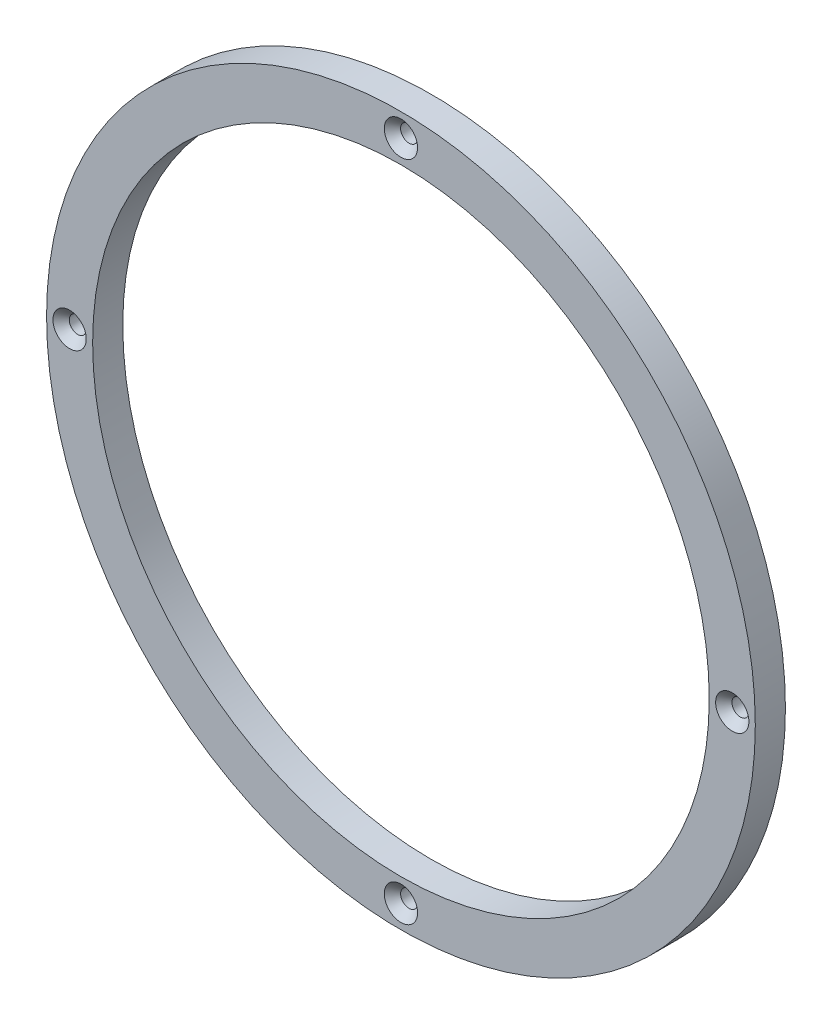
ISO-10303-21;
HEADER;
FILE_DESCRIPTION(('STEP AP214'),'2;1');
FILE_NAME('part.step','',(''),(''),'','','');
FILE_SCHEMA(('AUTOMOTIVE_DESIGN { 1 0 10303 214 1 1 1 1 }'));
ENDSEC;
DATA;
#1=APPLICATION_CONTEXT('core data for automotive mechanical design processes');
#2=APPLICATION_PROTOCOL_DEFINITION('international standard','automotive_design',2000,#1);
#3=PRODUCT_CONTEXT('',#1,'mechanical');
#4=PRODUCT('Part','Part','',(#3));
#5=PRODUCT_RELATED_PRODUCT_CATEGORY('part','',(#4));
#6=PRODUCT_DEFINITION_FORMATION('','',#4);
#7=PRODUCT_DEFINITION_CONTEXT('part definition',#1,'design');
#8=PRODUCT_DEFINITION('design','',#6,#7);
#9=PRODUCT_DEFINITION_SHAPE('','',#8);
#10=(LENGTH_UNIT() NAMED_UNIT(*) SI_UNIT(.MILLI.,.METRE.));
#11=(NAMED_UNIT(*) PLANE_ANGLE_UNIT() SI_UNIT($,.RADIAN.));
#12=(NAMED_UNIT(*) SI_UNIT($,.STERADIAN.) SOLID_ANGLE_UNIT());
#13=UNCERTAINTY_MEASURE_WITH_UNIT(LENGTH_MEASURE(1.E-05),#10,'distance_accuracy_value','');
#14=(GEOMETRIC_REPRESENTATION_CONTEXT(3) GLOBAL_UNCERTAINTY_ASSIGNED_CONTEXT((#13)) GLOBAL_UNIT_ASSIGNED_CONTEXT((#10,
#11,#12)) REPRESENTATION_CONTEXT('',''));
#15=CARTESIAN_POINT('',(0.,0.,0.));
#16=DIRECTION('',(0.,0.,1.));
#17=DIRECTION('',(1.,0.,0.));
#18=AXIS2_PLACEMENT_3D('',#15,#16,#17);
#19=CARTESIAN_POINT('',(0.,0.,8.5));
#20=DIRECTION('',(0.,0.,-1.));
#21=DIRECTION('',(-1.,0.,0.));
#22=AXIS2_PLACEMENT_3D('',#19,#20,#21);
#23=CYLINDRICAL_SURFACE('',#22,100.);
#24=CARTESIAN_POINT('',(0.,0.,8.5));
#25=DIRECTION('',(0.,0.,1.));
#26=DIRECTION('',(1.,0.,0.));
#27=AXIS2_PLACEMENT_3D('',#24,#25,#26);
#28=CIRCLE('',#27,100.);
#29=CARTESIAN_POINT('',(100.,0.,8.5));
#30=VERTEX_POINT('',#29);
#31=EDGE_CURVE('E43',#30,#30,#28,.T.);
#32=ORIENTED_EDGE('',*,*,#31,.F.);
#33=EDGE_LOOP('',(#32));
#34=FACE_BOUND('',#33,.T.);
#35=CARTESIAN_POINT('',(0.,0.,0.));
#36=DIRECTION('',(0.,0.,1.));
#37=DIRECTION('',(1.,0.,0.));
#38=AXIS2_PLACEMENT_3D('',#35,#36,#37);
#39=CIRCLE('',#38,100.);
#40=CARTESIAN_POINT('',(100.,0.,0.));
#41=VERTEX_POINT('',#40);
#42=EDGE_CURVE('E50',#41,#41,#39,.T.);
#43=ORIENTED_EDGE('',*,*,#42,.T.);
#44=EDGE_LOOP('',(#43));
#45=FACE_BOUND('',#44,.T.);
#46=ADVANCED_FACE('F36',(#34,#45),#23,.T.);
#47=CARTESIAN_POINT('',(0.,0.,8.5));
#48=DIRECTION('',(0.,0.,-1.));
#49=DIRECTION('',(-1.,0.,0.));
#50=AXIS2_PLACEMENT_3D('',#47,#48,#49);
#51=CYLINDRICAL_SURFACE('',#50,87.);
#52=CARTESIAN_POINT('',(0.,0.,8.5));
#53=DIRECTION('',(0.,0.,1.));
#54=DIRECTION('',(1.,0.,0.));
#55=AXIS2_PLACEMENT_3D('',#52,#53,#54);
#56=CIRCLE('',#55,87.);
#57=CARTESIAN_POINT('',(87.,0.,8.5));
#58=VERTEX_POINT('',#57);
#59=EDGE_CURVE('E10',#58,#58,#56,.T.);
#60=ORIENTED_EDGE('',*,*,#59,.T.);
#61=EDGE_LOOP('',(#60));
#62=FACE_BOUND('',#61,.T.);
#63=CARTESIAN_POINT('',(0.,0.,0.));
#64=DIRECTION('',(0.,0.,1.));
#65=DIRECTION('',(1.,0.,0.));
#66=AXIS2_PLACEMENT_3D('',#63,#64,#65);
#67=CIRCLE('',#66,87.);
#68=CARTESIAN_POINT('',(87.,0.,0.));
#69=VERTEX_POINT('',#68);
#70=EDGE_CURVE('E39',#69,#69,#67,.T.);
#71=ORIENTED_EDGE('',*,*,#70,.F.);
#72=EDGE_LOOP('',(#71));
#73=FACE_BOUND('',#72,.T.);
#74=ADVANCED_FACE('F100',(#62,#73),#51,.F.);
#75=CARTESIAN_POINT('',(0.,0.,8.5));
#76=DIRECTION('',(0.,0.,1.));
#77=DIRECTION('',(1.,0.,0.));
#78=AXIS2_PLACEMENT_3D('',#75,#76,#77);
#79=PLANE('',#78);
#80=CARTESIAN_POINT('',(-93.4999999999985,-1.53167760015142E-12,8.5));
#81=DIRECTION('',(0.,0.,1.));
#82=DIRECTION('',(1.,0.,0.));
#83=AXIS2_PLACEMENT_3D('',#80,#81,#82);
#84=CIRCLE('',#83,4.7);
#85=CARTESIAN_POINT('',(-88.7999999999985,-1.53167760015142E-12,8.5));
#86=VERTEX_POINT('',#85);
#87=EDGE_CURVE('E90',#86,#86,#84,.T.);
#88=ORIENTED_EDGE('',*,*,#87,.F.);
#89=EDGE_LOOP('',(#88));
#90=FACE_BOUND('',#89,.T.);
#91=CARTESIAN_POINT('',(0.,93.5,8.5));
#92=DIRECTION('',(0.,0.,1.));
#93=DIRECTION('',(1.,0.,0.));
#94=AXIS2_PLACEMENT_3D('',#91,#92,#93);
#95=CIRCLE('',#94,4.7);
#96=CARTESIAN_POINT('',(4.7,93.5,8.5));
#97=VERTEX_POINT('',#96);
#98=EDGE_CURVE('E81',#97,#97,#95,.T.);
#99=ORIENTED_EDGE('',*,*,#98,.F.);
#100=EDGE_LOOP('',(#99));
#101=FACE_BOUND('',#100,.T.);
#102=CARTESIAN_POINT('',(93.5000000000015,1.5202271525794E-12,8.5));
#103=DIRECTION('',(0.,0.,1.));
#104=DIRECTION('',(1.,0.,0.));
#105=AXIS2_PLACEMENT_3D('',#102,#103,#104);
#106=CIRCLE('',#105,4.7);
#107=CARTESIAN_POINT('',(98.2000000000015,1.5202271525794E-12,8.5));
#108=VERTEX_POINT('',#107);
#109=EDGE_CURVE('E72',#108,#108,#106,.T.);
#110=ORIENTED_EDGE('',*,*,#109,.F.);
#111=EDGE_LOOP('',(#110));
#112=FACE_BOUND('',#111,.T.);
#113=CARTESIAN_POINT('',(3.04045430515879E-12,-93.5,8.5));
#114=DIRECTION('',(0.,0.,1.));
#115=DIRECTION('',(1.,0.,0.));
#116=AXIS2_PLACEMENT_3D('',#113,#114,#115);
#117=CIRCLE('',#116,4.7);
#118=CARTESIAN_POINT('',(4.70000000000304,-93.5,8.5));
#119=VERTEX_POINT('',#118);
#120=EDGE_CURVE('E61',#119,#119,#117,.T.);
#121=ORIENTED_EDGE('',*,*,#120,.F.);
#122=EDGE_LOOP('',(#121));
#123=FACE_BOUND('',#122,.T.);
#124=ORIENTED_EDGE('',*,*,#31,.T.);
#125=EDGE_LOOP('',(#124));
#126=FACE_BOUND('',#125,.T.);
#127=ORIENTED_EDGE('',*,*,#59,.F.);
#128=EDGE_LOOP('',(#127));
#129=FACE_BOUND('',#128,.T.);
#130=ADVANCED_FACE('F96',(#90,#101,#112,#123,#126,#129),#79,.T.);
#131=CARTESIAN_POINT('',(0.,0.,0.));
#132=DIRECTION('',(0.,0.,1.));
#133=DIRECTION('',(1.,0.,0.));
#134=AXIS2_PLACEMENT_3D('',#131,#132,#133);
#135=PLANE('',#134);
#136=CARTESIAN_POINT('',(-93.4999999999985,-1.53167760015142E-12,0.));
#137=DIRECTION('',(0.,0.,1.));
#138=DIRECTION('',(1.,0.,0.));
#139=AXIS2_PLACEMENT_3D('',#136,#137,#138);
#140=CIRCLE('',#139,2.4);
#141=CARTESIAN_POINT('',(-91.0999999999985,-1.53167760015142E-12,0.));
#142=VERTEX_POINT('',#141);
#143=EDGE_CURVE('E84',#142,#142,#140,.T.);
#144=ORIENTED_EDGE('',*,*,#143,.T.);
#145=EDGE_LOOP('',(#144));
#146=FACE_BOUND('',#145,.T.);
#147=CARTESIAN_POINT('',(0.,93.5,0.));
#148=DIRECTION('',(0.,0.,1.));
#149=DIRECTION('',(1.,0.,0.));
#150=AXIS2_PLACEMENT_3D('',#147,#148,#149);
#151=CIRCLE('',#150,2.4);
#152=CARTESIAN_POINT('',(2.4,93.5,0.));
#153=VERTEX_POINT('',#152);
#154=EDGE_CURVE('E75',#153,#153,#151,.T.);
#155=ORIENTED_EDGE('',*,*,#154,.T.);
#156=EDGE_LOOP('',(#155));
#157=FACE_BOUND('',#156,.T.);
#158=CARTESIAN_POINT('',(93.5000000000015,1.5202271525794E-12,0.));
#159=DIRECTION('',(0.,0.,1.));
#160=DIRECTION('',(1.,0.,0.));
#161=AXIS2_PLACEMENT_3D('',#158,#159,#160);
#162=CIRCLE('',#161,2.4);
#163=CARTESIAN_POINT('',(95.9000000000015,1.5202271525794E-12,0.));
#164=VERTEX_POINT('',#163);
#165=EDGE_CURVE('E66',#164,#164,#162,.T.);
#166=ORIENTED_EDGE('',*,*,#165,.T.);
#167=EDGE_LOOP('',(#166));
#168=FACE_BOUND('',#167,.T.);
#169=CARTESIAN_POINT('',(3.04045430515879E-12,-93.5,0.));
#170=DIRECTION('',(0.,0.,1.));
#171=DIRECTION('',(1.,0.,0.));
#172=AXIS2_PLACEMENT_3D('',#169,#170,#171);
#173=CIRCLE('',#172,2.4);
#174=CARTESIAN_POINT('',(2.40000000000304,-93.5,0.));
#175=VERTEX_POINT('',#174);
#176=EDGE_CURVE('E52',#175,#175,#173,.T.);
#177=ORIENTED_EDGE('',*,*,#176,.T.);
#178=EDGE_LOOP('',(#177));
#179=FACE_BOUND('',#178,.T.);
#180=ORIENTED_EDGE('',*,*,#42,.F.);
#181=EDGE_LOOP('',(#180));
#182=FACE_BOUND('',#181,.T.);
#183=ORIENTED_EDGE('',*,*,#70,.T.);
#184=EDGE_LOOP('',(#183));
#185=FACE_BOUND('',#184,.T.);
#186=ADVANCED_FACE('F99',(#146,#157,#168,#179,#182,#185),#135,.F.);
#187=CARTESIAN_POINT('',(3.04045430515879E-12,-93.5,8.5));
#188=DIRECTION('',(0.,0.,1.));
#189=DIRECTION('',(1.,0.,0.));
#190=AXIS2_PLACEMENT_3D('',#187,#188,#189);
#191=CYLINDRICAL_SURFACE('',#190,2.4);
#192=ORIENTED_EDGE('',*,*,#176,.F.);
#193=EDGE_LOOP('',(#192));
#194=FACE_BOUND('',#193,.T.);
#195=CARTESIAN_POINT('',(3.04045430515879E-12,-93.5,6.2));
#196=DIRECTION('',(0.,0.,1.));
#197=DIRECTION('',(1.,0.,0.));
#198=AXIS2_PLACEMENT_3D('',#195,#196,#197);
#199=CIRCLE('',#198,2.4);
#200=CARTESIAN_POINT('',(2.40000000000304,-93.5,6.2));
#201=VERTEX_POINT('',#200);
#202=EDGE_CURVE('E57',#201,#201,#199,.T.);
#203=ORIENTED_EDGE('',*,*,#202,.T.);
#204=EDGE_LOOP('',(#203));
#205=FACE_BOUND('',#204,.T.);
#206=ADVANCED_FACE('F120',(#194,#205),#191,.F.);
#207=CARTESIAN_POINT('',(3.04045430515879E-12,-93.5,8.5));
#208=DIRECTION('',(0.,0.,1.));
#209=DIRECTION('',(1.,0.,0.));
#210=AXIS2_PLACEMENT_3D('',#207,#208,#209);
#211=CONICAL_SURFACE('',#210,4.7,0.785398163397449);
#212=ORIENTED_EDGE('',*,*,#202,.F.);
#213=EDGE_LOOP('',(#212));
#214=FACE_BOUND('',#213,.T.);
#215=ORIENTED_EDGE('',*,*,#120,.T.);
#216=EDGE_LOOP('',(#215));
#217=FACE_BOUND('',#216,.T.);
#218=ADVANCED_FACE('F125',(#214,#217),#211,.F.);
#219=CARTESIAN_POINT('',(93.5000000000015,1.5202271525794E-12,8.5));
#220=DIRECTION('',(0.,0.,1.));
#221=DIRECTION('',(1.,0.,0.));
#222=AXIS2_PLACEMENT_3D('',#219,#220,#221);
#223=CYLINDRICAL_SURFACE('',#222,2.4);
#224=ORIENTED_EDGE('',*,*,#165,.F.);
#225=EDGE_LOOP('',(#224));
#226=FACE_BOUND('',#225,.T.);
#227=CARTESIAN_POINT('',(93.5000000000015,1.5202271525794E-12,6.2));
#228=DIRECTION('',(0.,0.,1.));
#229=DIRECTION('',(1.,0.,0.));
#230=AXIS2_PLACEMENT_3D('',#227,#228,#229);
#231=CIRCLE('',#230,2.4);
#232=CARTESIAN_POINT('',(95.9000000000015,1.5202271525794E-12,6.2));
#233=VERTEX_POINT('',#232);
#234=EDGE_CURVE('E69',#233,#233,#231,.T.);
#235=ORIENTED_EDGE('',*,*,#234,.T.);
#236=EDGE_LOOP('',(#235));
#237=FACE_BOUND('',#236,.T.);
#238=ADVANCED_FACE('F129',(#226,#237),#223,.F.);
#239=CARTESIAN_POINT('',(93.5000000000015,1.5202271525794E-12,8.5));
#240=DIRECTION('',(0.,0.,1.));
#241=DIRECTION('',(1.,0.,0.));
#242=AXIS2_PLACEMENT_3D('',#239,#240,#241);
#243=CONICAL_SURFACE('',#242,4.7,0.785398163397447);
#244=ORIENTED_EDGE('',*,*,#234,.F.);
#245=EDGE_LOOP('',(#244));
#246=FACE_BOUND('',#245,.T.);
#247=ORIENTED_EDGE('',*,*,#109,.T.);
#248=EDGE_LOOP('',(#247));
#249=FACE_BOUND('',#248,.T.);
#250=ADVANCED_FACE('F133',(#246,#249),#243,.F.);
#251=CARTESIAN_POINT('',(0.,93.5,8.5));
#252=DIRECTION('',(0.,0.,1.));
#253=DIRECTION('',(1.,0.,0.));
#254=AXIS2_PLACEMENT_3D('',#251,#252,#253);
#255=CYLINDRICAL_SURFACE('',#254,2.4);
#256=ORIENTED_EDGE('',*,*,#154,.F.);
#257=EDGE_LOOP('',(#256));
#258=FACE_BOUND('',#257,.T.);
#259=CARTESIAN_POINT('',(0.,93.5,6.2));
#260=DIRECTION('',(0.,0.,1.));
#261=DIRECTION('',(1.,0.,0.));
#262=AXIS2_PLACEMENT_3D('',#259,#260,#261);
#263=CIRCLE('',#262,2.4);
#264=CARTESIAN_POINT('',(2.4,93.5,6.2));
#265=VERTEX_POINT('',#264);
#266=EDGE_CURVE('E78',#265,#265,#263,.T.);
#267=ORIENTED_EDGE('',*,*,#266,.T.);
#268=EDGE_LOOP('',(#267));
#269=FACE_BOUND('',#268,.T.);
#270=ADVANCED_FACE('F137',(#258,#269),#255,.F.);
#271=CARTESIAN_POINT('',(0.,93.5,8.5));
#272=DIRECTION('',(0.,0.,1.));
#273=DIRECTION('',(1.,0.,0.));
#274=AXIS2_PLACEMENT_3D('',#271,#272,#273);
#275=CONICAL_SURFACE('',#274,4.7,0.785398163397449);
#276=ORIENTED_EDGE('',*,*,#266,.F.);
#277=EDGE_LOOP('',(#276));
#278=FACE_BOUND('',#277,.T.);
#279=ORIENTED_EDGE('',*,*,#98,.T.);
#280=EDGE_LOOP('',(#279));
#281=FACE_BOUND('',#280,.T.);
#282=ADVANCED_FACE('F141',(#278,#281),#275,.F.);
#283=CARTESIAN_POINT('',(-93.4999999999985,-1.53167760015142E-12,8.5));
#284=DIRECTION('',(0.,0.,1.));
#285=DIRECTION('',(1.,0.,0.));
#286=AXIS2_PLACEMENT_3D('',#283,#284,#285);
#287=CYLINDRICAL_SURFACE('',#286,2.4);
#288=ORIENTED_EDGE('',*,*,#143,.F.);
#289=EDGE_LOOP('',(#288));
#290=FACE_BOUND('',#289,.T.);
#291=CARTESIAN_POINT('',(-93.4999999999985,-1.53167760015142E-12,6.2));
#292=DIRECTION('',(0.,0.,1.));
#293=DIRECTION('',(1.,0.,0.));
#294=AXIS2_PLACEMENT_3D('',#291,#292,#293);
#295=CIRCLE('',#294,2.4);
#296=CARTESIAN_POINT('',(-91.0999999999985,-1.53167760015142E-12,6.2));
#297=VERTEX_POINT('',#296);
#298=EDGE_CURVE('E87',#297,#297,#295,.T.);
#299=ORIENTED_EDGE('',*,*,#298,.T.);
#300=EDGE_LOOP('',(#299));
#301=FACE_BOUND('',#300,.T.);
#302=ADVANCED_FACE('F145',(#290,#301),#287,.F.);
#303=CARTESIAN_POINT('',(-93.4999999999985,-1.53167760015142E-12,8.5));
#304=DIRECTION('',(0.,0.,1.));
#305=DIRECTION('',(1.,0.,0.));
#306=AXIS2_PLACEMENT_3D('',#303,#304,#305);
#307=CONICAL_SURFACE('',#306,4.7,0.785398163397447);
#308=ORIENTED_EDGE('',*,*,#298,.F.);
#309=EDGE_LOOP('',(#308));
#310=FACE_BOUND('',#309,.T.);
#311=ORIENTED_EDGE('',*,*,#87,.T.);
#312=EDGE_LOOP('',(#311));
#313=FACE_BOUND('',#312,.T.);
#314=ADVANCED_FACE('F94',(#310,#313),#307,.F.);
#315=CLOSED_SHELL('',(#46,#74,#130,#186,#206,#218,#238,#250,#270,#282,#302,#314));
#316=MANIFOLD_SOLID_BREP('B2',#315);
#317=ADVANCED_BREP_SHAPE_REPRESENTATION('',(#18,#316),#14);
#318=SHAPE_DEFINITION_REPRESENTATION(#9,#317);
ENDSEC;
END-ISO-10303-21;
